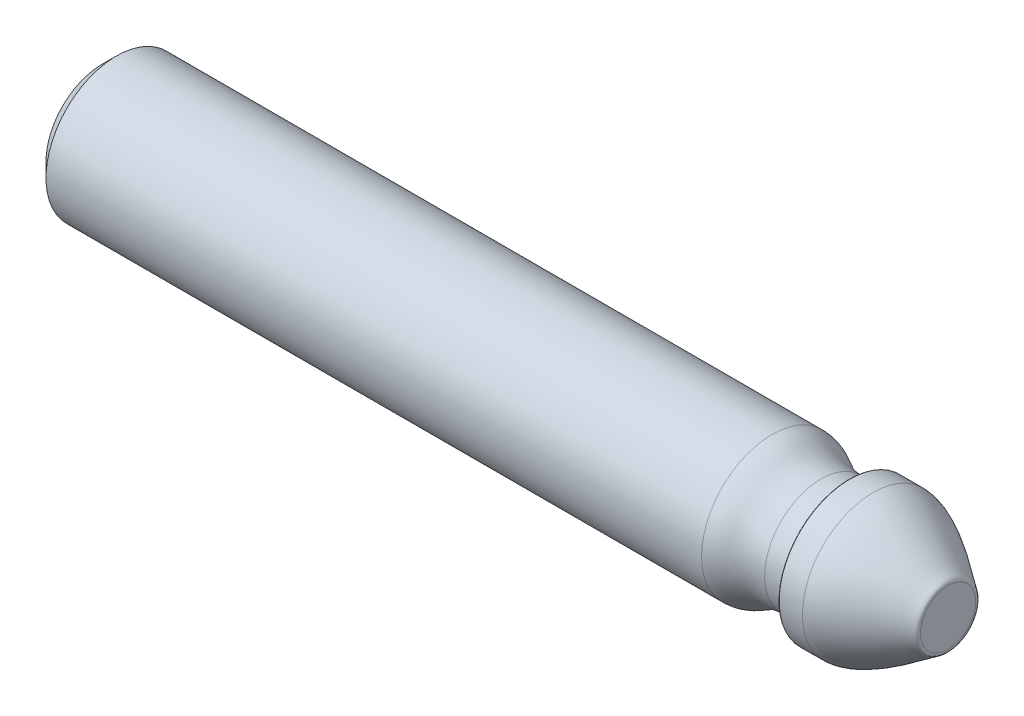
ISO-10303-21;
HEADER;
FILE_DESCRIPTION(('STEP AP214'),'2;1');
FILE_NAME('part.step','',(''),(''),'','','');
FILE_SCHEMA(('AUTOMOTIVE_DESIGN { 1 0 10303 214 1 1 1 1 }'));
ENDSEC;
DATA;
#1=APPLICATION_CONTEXT('core data for automotive mechanical design processes');
#2=APPLICATION_PROTOCOL_DEFINITION('international standard','automotive_design',2000,#1);
#3=PRODUCT_CONTEXT('',#1,'mechanical');
#4=PRODUCT('Part','Part','',(#3));
#5=PRODUCT_RELATED_PRODUCT_CATEGORY('part','',(#4));
#6=PRODUCT_DEFINITION_FORMATION('','',#4);
#7=PRODUCT_DEFINITION_CONTEXT('part definition',#1,'design');
#8=PRODUCT_DEFINITION('design','',#6,#7);
#9=PRODUCT_DEFINITION_SHAPE('','',#8);
#10=(LENGTH_UNIT() NAMED_UNIT(*) SI_UNIT(.MILLI.,.METRE.));
#11=(NAMED_UNIT(*) PLANE_ANGLE_UNIT() SI_UNIT($,.RADIAN.));
#12=(NAMED_UNIT(*) SI_UNIT($,.STERADIAN.) SOLID_ANGLE_UNIT());
#13=UNCERTAINTY_MEASURE_WITH_UNIT(LENGTH_MEASURE(1.E-05),#10,'distance_accuracy_value','');
#14=(GEOMETRIC_REPRESENTATION_CONTEXT(3) GLOBAL_UNCERTAINTY_ASSIGNED_CONTEXT((#13)) GLOBAL_UNIT_ASSIGNED_CONTEXT((#10,
#11,#12)) REPRESENTATION_CONTEXT('',''));
#15=CARTESIAN_POINT('',(0.,0.,0.));
#16=DIRECTION('',(0.,0.,1.));
#17=DIRECTION('',(1.,0.,0.));
#18=AXIS2_PLACEMENT_3D('',#15,#16,#17);
#19=CARTESIAN_POINT('',(-19.05,0.,0.));
#20=DIRECTION('',(1.,0.,0.));
#21=DIRECTION('',(0.,0.,-1.));
#22=AXIS2_PLACEMENT_3D('',#19,#20,#21);
#23=CYLINDRICAL_SURFACE('',#22,3.175);
#24=CARTESIAN_POINT('',(-18.415,0.,0.));
#25=DIRECTION('',(1.,0.,0.));
#26=DIRECTION('',(0.,0.,-1.));
#27=AXIS2_PLACEMENT_3D('',#24,#25,#26);
#28=CIRCLE('',#27,3.175);
#29=CARTESIAN_POINT('',(-18.415,0.,-3.175));
#30=VERTEX_POINT('',#29);
#31=EDGE_CURVE('E45',#30,#30,#28,.T.);
#32=ORIENTED_EDGE('',*,*,#31,.T.);
#33=EDGE_LOOP('',(#32));
#34=FACE_BOUND('',#33,.T.);
#35=CARTESIAN_POINT('',(11.1186565977839,0.,0.));
#36=DIRECTION('',(-1.,0.,0.));
#37=DIRECTION('',(0.,0.,1.));
#38=AXIS2_PLACEMENT_3D('',#35,#36,#37);
#39=CIRCLE('',#38,3.175);
#40=CARTESIAN_POINT('',(11.1186565977839,0.,3.175));
#41=VERTEX_POINT('',#40);
#42=EDGE_CURVE('E56',#41,#41,#39,.T.);
#43=ORIENTED_EDGE('',*,*,#42,.T.);
#44=EDGE_LOOP('',(#43));
#45=FACE_BOUND('',#44,.T.);
#46=ADVANCED_FACE('F30',(#34,#45),#23,.T.);
#47=CARTESIAN_POINT('',(-19.05,0.,0.));
#48=DIRECTION('',(1.,0.,0.));
#49=DIRECTION('',(0.,0.,-1.));
#50=AXIS2_PLACEMENT_3D('',#47,#48,#49);
#51=PLANE('',#50);
#52=CARTESIAN_POINT('',(-19.05,0.,0.));
#53=DIRECTION('',(1.,0.,0.));
#54=DIRECTION('',(0.,0.,-1.));
#55=AXIS2_PLACEMENT_3D('',#52,#53,#54);
#56=CIRCLE('',#55,2.54);
#57=CARTESIAN_POINT('',(-19.05,0.,-2.54));
#58=VERTEX_POINT('',#57);
#59=EDGE_CURVE('E41',#58,#58,#56,.F.);
#60=ORIENTED_EDGE('',*,*,#59,.T.);
#61=EDGE_LOOP('',(#60));
#62=FACE_BOUND('',#61,.T.);
#63=ADVANCED_FACE('F80',(#62),#51,.F.);
#64=CARTESIAN_POINT('',(-18.415,0.,0.));
#65=DIRECTION('',(1.,0.,0.));
#66=DIRECTION('',(0.,0.,-1.));
#67=AXIS2_PLACEMENT_3D('',#64,#65,#66);
#68=CONICAL_SURFACE('',#67,3.175,0.785398163397453);
#69=ORIENTED_EDGE('',*,*,#59,.F.);
#70=EDGE_LOOP('',(#69));
#71=FACE_BOUND('',#70,.T.);
#72=ORIENTED_EDGE('',*,*,#31,.F.);
#73=EDGE_LOOP('',(#72));
#74=FACE_BOUND('',#73,.T.);
#75=ADVANCED_FACE('F83',(#71,#74),#68,.T.);
#76=CARTESIAN_POINT('',(11.1186565977839,3.175,0.));
#77=CARTESIAN_POINT('',(11.9879137346825,3.175,0.));
#78=CARTESIAN_POINT('',(12.0733688000221,2.54,0.));
#79=CARTESIAN_POINT('',(13.3234092854908,2.54,0.));
#80=B_SPLINE_CURVE_WITH_KNOTS('',3,(#76,#77,#78,#79),.UNSPECIFIED.,.F.,.F.,(4,4),(0.,1.),.UNSPECIFIED.);
#81=CARTESIAN_POINT('',(-19.05,0.,0.));
#82=DIRECTION('',(-1.,0.,0.));
#83=AXIS1_PLACEMENT('',#81,#82);
#84=SURFACE_OF_REVOLUTION('',#80,#83);
#85=CARTESIAN_POINT('',(13.3234092854908,0.,0.));
#86=DIRECTION('',(-1.,0.,0.));
#87=DIRECTION('',(0.,0.,1.));
#88=AXIS2_PLACEMENT_3D('',#85,#86,#87);
#89=CIRCLE('',#88,2.54);
#90=CARTESIAN_POINT('',(13.3234092854908,0.,2.54));
#91=VERTEX_POINT('',#90);
#92=EDGE_CURVE('E104',#91,#91,#89,.T.);
#93=ORIENTED_EDGE('',*,*,#92,.T.);
#94=EDGE_LOOP('',(#93));
#95=FACE_BOUND('',#94,.T.);
#96=ORIENTED_EDGE('',*,*,#42,.F.);
#97=EDGE_LOOP('',(#96));
#98=FACE_BOUND('',#97,.T.);
#99=ADVANCED_FACE('F73',(#95,#98),#84,.F.);
#100=CARTESIAN_POINT('',(-19.05,0.,0.));
#101=DIRECTION('',(-1.,0.,0.));
#102=DIRECTION('',(0.,0.,1.));
#103=AXIS2_PLACEMENT_3D('',#100,#101,#102);
#104=CYLINDRICAL_SURFACE('',#103,2.54);
#105=ORIENTED_EDGE('',*,*,#92,.F.);
#106=EDGE_LOOP('',(#105));
#107=FACE_BOUND('',#106,.T.);
#108=CARTESIAN_POINT('',(14.5934092854908,0.,0.));
#109=DIRECTION('',(-1.,0.,0.));
#110=DIRECTION('',(0.,0.,1.));
#111=AXIS2_PLACEMENT_3D('',#108,#109,#110);
#112=CIRCLE('',#111,2.54);
#113=CARTESIAN_POINT('',(14.5934092854908,0.,2.54));
#114=VERTEX_POINT('',#113);
#115=EDGE_CURVE('E106',#114,#114,#112,.T.);
#116=ORIENTED_EDGE('',*,*,#115,.T.);
#117=EDGE_LOOP('',(#116));
#118=FACE_BOUND('',#117,.T.);
#119=ADVANCED_FACE('F91',(#107,#118),#104,.T.);
#120=CARTESIAN_POINT('',(14.5934092854908,0.,0.));
#121=DIRECTION('',(1.,0.,0.));
#122=DIRECTION('',(0.,0.,-1.));
#123=AXIS2_PLACEMENT_3D('',#120,#121,#122);
#124=PLANE('',#123);
#125=CARTESIAN_POINT('',(14.5934092854908,0.,0.));
#126=DIRECTION('',(1.,0.,0.));
#127=DIRECTION('',(0.,0.,-1.));
#128=AXIS2_PLACEMENT_3D('',#125,#126,#127);
#129=CIRCLE('',#128,3.1496);
#130=CARTESIAN_POINT('',(14.5934092854908,0.,-3.1496));
#131=VERTEX_POINT('',#130);
#132=EDGE_CURVE('E37',#131,#131,#129,.F.);
#133=ORIENTED_EDGE('',*,*,#132,.T.);
#134=EDGE_LOOP('',(#133));
#135=FACE_BOUND('',#134,.T.);
#136=ORIENTED_EDGE('',*,*,#115,.F.);
#137=EDGE_LOOP('',(#136));
#138=FACE_BOUND('',#137,.T.);
#139=ADVANCED_FACE('F78',(#135,#138),#124,.F.);
#140=CARTESIAN_POINT('',(19.05,0.,0.));
#141=DIRECTION('',(1.,0.,0.));
#142=DIRECTION('',(0.,0.,-1.));
#143=AXIS2_PLACEMENT_3D('',#140,#141,#142);
#144=PLANE('',#143);
#145=CARTESIAN_POINT('',(19.05,0.,0.));
#146=DIRECTION('',(-1.,0.,0.));
#147=DIRECTION('',(0.,0.,1.));
#148=AXIS2_PLACEMENT_3D('',#145,#146,#147);
#149=CIRCLE('',#148,1.24339040779095);
#150=CARTESIAN_POINT('',(19.05,0.,1.24339040779095));
#151=VERTEX_POINT('',#150);
#152=EDGE_CURVE('E53',#151,#151,#149,.T.);
#153=ORIENTED_EDGE('',*,*,#152,.F.);
#154=EDGE_LOOP('',(#153));
#155=FACE_BOUND('',#154,.T.);
#156=ADVANCED_FACE('F71',(#155),#144,.T.);
#157=CARTESIAN_POINT('',(15.6622266724955,3.175,0.));
#158=CARTESIAN_POINT('',(16.6427631940523,3.175,0.));
#159=CARTESIAN_POINT('',(18.6139911335701,1.63107342817395,0.));
#160=CARTESIAN_POINT('',(19.0440963657568,1.38249527756455,0.));
#161=CARTESIAN_POINT('',(19.05,1.34872730936885,0.));
#162=CARTESIAN_POINT('',(19.05,1.24339040779095,0.));
#163=B_SPLINE_CURVE_WITH_KNOTS('',3,(#157,#158,#159,#160,#161,#162),.UNSPECIFIED.,.F.,.F.,(4,1,
1,4),(0.,0.565725481373392,0.665725481373391,1.),.UNSPECIFIED.);
#164=CARTESIAN_POINT('',(-19.05,0.,0.));
#165=DIRECTION('',(-1.,0.,0.));
#166=AXIS1_PLACEMENT('',#164,#165);
#167=SURFACE_OF_REVOLUTION('',#163,#166);
#168=ORIENTED_EDGE('',*,*,#152,.T.);
#169=EDGE_LOOP('',(#168));
#170=FACE_BOUND('',#169,.T.);
#171=CARTESIAN_POINT('',(15.6622266724955,0.,0.));
#172=DIRECTION('',(-1.,0.,0.));
#173=DIRECTION('',(0.,0.,1.));
#174=AXIS2_PLACEMENT_3D('',#171,#172,#173);
#175=CIRCLE('',#174,3.175);
#176=CARTESIAN_POINT('',(15.6622266724955,0.,3.175));
#177=VERTEX_POINT('',#176);
#178=EDGE_CURVE('E50',#177,#177,#175,.T.);
#179=ORIENTED_EDGE('',*,*,#178,.F.);
#180=EDGE_LOOP('',(#179));
#181=FACE_BOUND('',#180,.T.);
#182=ADVANCED_FACE('F66',(#170,#181),#167,.F.);
#183=CARTESIAN_POINT('',(14.6188092854908,0.,0.));
#184=DIRECTION('',(1.,0.,0.));
#185=DIRECTION('',(0.,0.,-1.));
#186=AXIS2_PLACEMENT_3D('',#183,#184,#185);
#187=CIRCLE('',#186,3.175);
#188=CARTESIAN_POINT('',(14.6188092854908,0.,-3.175));
#189=VERTEX_POINT('',#188);
#190=EDGE_CURVE('E10',#189,#189,#187,.T.);
#191=ORIENTED_EDGE('',*,*,#190,.T.);
#192=EDGE_LOOP('',(#191));
#193=FACE_BOUND('',#192,.T.);
#194=ORIENTED_EDGE('',*,*,#178,.T.);
#195=EDGE_LOOP('',(#194));
#196=FACE_BOUND('',#195,.T.);
#197=ADVANCED_FACE('F70',(#193,#196),#23,.T.);
#198=CARTESIAN_POINT('',(14.6188092854908,0.,0.));
#199=DIRECTION('',(1.,0.,0.));
#200=DIRECTION('',(0.,0.,-1.));
#201=AXIS2_PLACEMENT_3D('',#198,#199,#200);
#202=TOROIDAL_SURFACE('',#201,3.1496,0.0254);
#203=ORIENTED_EDGE('',*,*,#190,.F.);
#204=EDGE_LOOP('',(#203));
#205=FACE_BOUND('',#204,.T.);
#206=ORIENTED_EDGE('',*,*,#132,.F.);
#207=EDGE_LOOP('',(#206));
#208=FACE_BOUND('',#207,.T.);
#209=ADVANCED_FACE('F32',(#205,#208),#202,.T.);
#210=CLOSED_SHELL('',(#46,#63,#75,#99,#119,#139,#156,#182,#197,#209));
#211=MANIFOLD_SOLID_BREP('B2',#210);
#212=ADVANCED_BREP_SHAPE_REPRESENTATION('',(#18,#211),#14);
#213=SHAPE_DEFINITION_REPRESENTATION(#9,#212);
ENDSEC;
END-ISO-10303-21;
